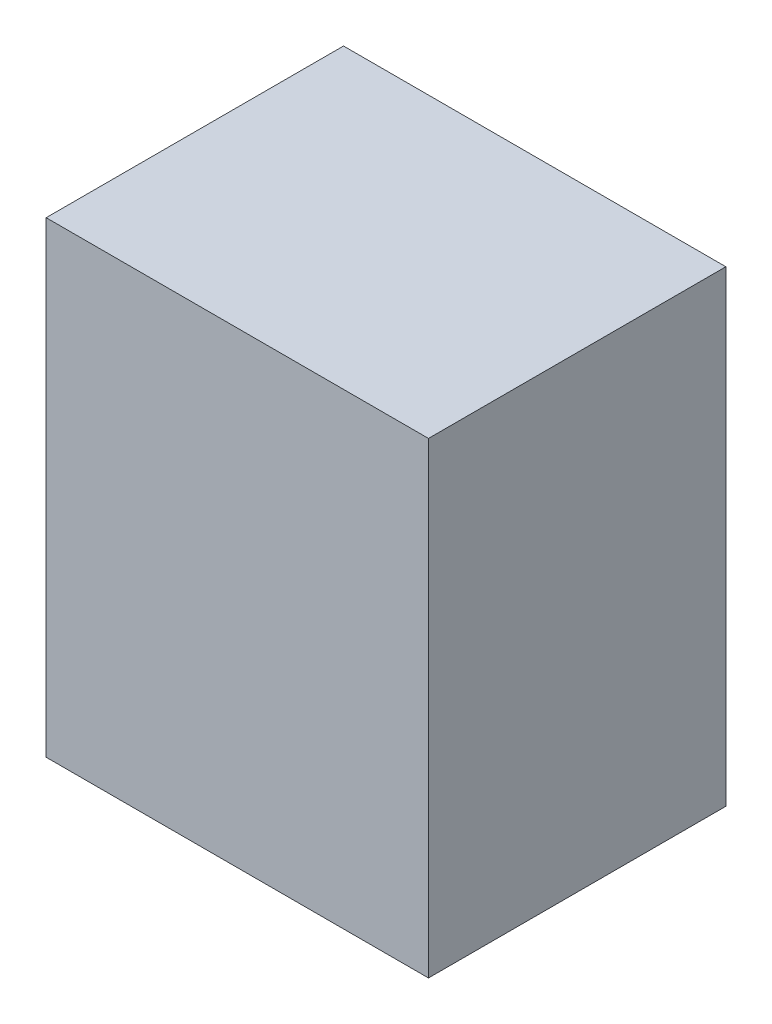
ISO-10303-21;
HEADER;
FILE_DESCRIPTION(('STEP AP214'),'2;1');
FILE_NAME('part.step','',(''),(''),'','','');
FILE_SCHEMA(('AUTOMOTIVE_DESIGN { 1 0 10303 214 1 1 1 1 }'));
ENDSEC;
DATA;
#1=APPLICATION_CONTEXT('core data for automotive mechanical design processes');
#2=APPLICATION_PROTOCOL_DEFINITION('international standard','automotive_design',2000,#1);
#3=PRODUCT_CONTEXT('',#1,'mechanical');
#4=PRODUCT('Part','Part','',(#3));
#5=PRODUCT_RELATED_PRODUCT_CATEGORY('part','',(#4));
#6=PRODUCT_DEFINITION_FORMATION('','',#4);
#7=PRODUCT_DEFINITION_CONTEXT('part definition',#1,'design');
#8=PRODUCT_DEFINITION('design','',#6,#7);
#9=PRODUCT_DEFINITION_SHAPE('','',#8);
#10=(LENGTH_UNIT() NAMED_UNIT(*) SI_UNIT(.MILLI.,.METRE.));
#11=(NAMED_UNIT(*) PLANE_ANGLE_UNIT() SI_UNIT($,.RADIAN.));
#12=(NAMED_UNIT(*) SI_UNIT($,.STERADIAN.) SOLID_ANGLE_UNIT());
#13=UNCERTAINTY_MEASURE_WITH_UNIT(LENGTH_MEASURE(1.E-05),#10,'distance_accuracy_value','');
#14=(GEOMETRIC_REPRESENTATION_CONTEXT(3) GLOBAL_UNCERTAINTY_ASSIGNED_CONTEXT((#13)) GLOBAL_UNIT_ASSIGNED_CONTEXT((#10,
#11,#12)) REPRESENTATION_CONTEXT('',''));
#15=CARTESIAN_POINT('',(0.,0.,0.));
#16=DIRECTION('',(0.,0.,1.));
#17=DIRECTION('',(1.,0.,0.));
#18=AXIS2_PLACEMENT_3D('',#15,#16,#17);
#19=CARTESIAN_POINT('',(0.,0.,3.5));
#20=DIRECTION('',(1.,0.,0.));
#21=DIRECTION('',(0.,0.,-1.));
#22=AXIS2_PLACEMENT_3D('',#19,#20,#21);
#23=PLANE('',#22);
#24=DIRECTION('',(0.,-1.,0.));
#25=VECTOR('',#24,1.);
#26=CARTESIAN_POINT('',(0.,0.,0.));
#27=LINE('',#26,#25);
#28=CARTESIAN_POINT('',(0.,5.5,0.));
#29=VERTEX_POINT('',#28);
#30=CARTESIAN_POINT('',(0.,0.,0.));
#31=VERTEX_POINT('',#30);
#32=EDGE_CURVE('E96',#29,#31,#27,.T.);
#33=ORIENTED_EDGE('',*,*,#32,.T.);
#34=DIRECTION('',(0.,0.,-1.));
#35=VECTOR('',#34,1.);
#36=CARTESIAN_POINT('',(0.,0.,3.5));
#37=LINE('',#36,#35);
#38=CARTESIAN_POINT('',(0.,0.,3.5));
#39=VERTEX_POINT('',#38);
#40=EDGE_CURVE('E11',#39,#31,#37,.T.);
#41=ORIENTED_EDGE('',*,*,#40,.F.);
#42=DIRECTION('',(0.,-1.,0.));
#43=VECTOR('',#42,1.);
#44=CARTESIAN_POINT('',(0.,0.,3.5));
#45=LINE('',#44,#43);
#46=CARTESIAN_POINT('',(0.,5.5,3.5));
#47=VERTEX_POINT('',#46);
#48=EDGE_CURVE('E84',#47,#39,#45,.T.);
#49=ORIENTED_EDGE('',*,*,#48,.F.);
#50=DIRECTION('',(0.,0.,-1.));
#51=VECTOR('',#50,1.);
#52=CARTESIAN_POINT('',(0.,5.5,3.5));
#53=LINE('',#52,#51);
#54=EDGE_CURVE('E92',#47,#29,#53,.T.);
#55=ORIENTED_EDGE('',*,*,#54,.T.);
#56=EDGE_LOOP('',(#33,#41,#49,#55));
#57=FACE_BOUND('',#56,.T.);
#58=ADVANCED_FACE('F33',(#57),#23,.F.);
#59=CARTESIAN_POINT('',(0.,0.,3.5));
#60=DIRECTION('',(0.,1.,0.));
#61=DIRECTION('',(0.,0.,1.));
#62=AXIS2_PLACEMENT_3D('',#59,#60,#61);
#63=PLANE('',#62);
#64=DIRECTION('',(1.,0.,0.));
#65=VECTOR('',#64,1.);
#66=CARTESIAN_POINT('',(0.,0.,0.));
#67=LINE('',#66,#65);
#68=CARTESIAN_POINT('',(4.5,0.,0.));
#69=VERTEX_POINT('',#68);
#70=EDGE_CURVE('E88',#31,#69,#67,.T.);
#71=ORIENTED_EDGE('',*,*,#70,.T.);
#72=DIRECTION('',(0.,0.,-1.));
#73=VECTOR('',#72,1.);
#74=CARTESIAN_POINT('',(4.5,0.,3.5));
#75=LINE('',#74,#73);
#76=CARTESIAN_POINT('',(4.5,0.,3.5));
#77=VERTEX_POINT('',#76);
#78=EDGE_CURVE('E41',#77,#69,#75,.T.);
#79=ORIENTED_EDGE('',*,*,#78,.F.);
#80=DIRECTION('',(1.,0.,0.));
#81=VECTOR('',#80,1.);
#82=CARTESIAN_POINT('',(0.,0.,3.5));
#83=LINE('',#82,#81);
#84=EDGE_CURVE('E79',#39,#77,#83,.T.);
#85=ORIENTED_EDGE('',*,*,#84,.F.);
#86=ORIENTED_EDGE('',*,*,#40,.T.);
#87=EDGE_LOOP('',(#71,#79,#85,#86));
#88=FACE_BOUND('',#87,.T.);
#89=ADVANCED_FACE('F87',(#88),#63,.F.);
#90=CARTESIAN_POINT('',(4.5,0.,3.5));
#91=DIRECTION('',(-1.,0.,0.));
#92=DIRECTION('',(0.,0.,1.));
#93=AXIS2_PLACEMENT_3D('',#90,#91,#92);
#94=PLANE('',#93);
#95=DIRECTION('',(0.,1.,0.));
#96=VECTOR('',#95,1.);
#97=CARTESIAN_POINT('',(4.5,0.,0.));
#98=LINE('',#97,#96);
#99=CARTESIAN_POINT('',(4.5,5.5,0.));
#100=VERTEX_POINT('',#99);
#101=EDGE_CURVE('E66',#69,#100,#98,.T.);
#102=ORIENTED_EDGE('',*,*,#101,.T.);
#103=DIRECTION('',(0.,0.,-1.));
#104=VECTOR('',#103,1.);
#105=CARTESIAN_POINT('',(4.5,5.5,3.5));
#106=LINE('',#105,#104);
#107=CARTESIAN_POINT('',(4.5,5.5,3.5));
#108=VERTEX_POINT('',#107);
#109=EDGE_CURVE('E89',#108,#100,#106,.T.);
#110=ORIENTED_EDGE('',*,*,#109,.F.);
#111=DIRECTION('',(0.,1.,0.));
#112=VECTOR('',#111,1.);
#113=CARTESIAN_POINT('',(4.5,0.,3.5));
#114=LINE('',#113,#112);
#115=EDGE_CURVE('E82',#77,#108,#114,.T.);
#116=ORIENTED_EDGE('',*,*,#115,.F.);
#117=ORIENTED_EDGE('',*,*,#78,.T.);
#118=EDGE_LOOP('',(#102,#110,#116,#117));
#119=FACE_BOUND('',#118,.T.);
#120=ADVANCED_FACE('F90',(#119),#94,.F.);
#121=CARTESIAN_POINT('',(0.,5.5,3.5));
#122=DIRECTION('',(0.,-1.,0.));
#123=DIRECTION('',(0.,0.,-1.));
#124=AXIS2_PLACEMENT_3D('',#121,#122,#123);
#125=PLANE('',#124);
#126=DIRECTION('',(-1.,0.,0.));
#127=VECTOR('',#126,1.);
#128=CARTESIAN_POINT('',(0.,5.5,0.));
#129=LINE('',#128,#127);
#130=EDGE_CURVE('E72',#100,#29,#129,.T.);
#131=ORIENTED_EDGE('',*,*,#130,.T.);
#132=ORIENTED_EDGE('',*,*,#54,.F.);
#133=DIRECTION('',(-1.,0.,0.));
#134=VECTOR('',#133,1.);
#135=CARTESIAN_POINT('',(0.,5.5,3.5));
#136=LINE('',#135,#134);
#137=EDGE_CURVE('E49',#108,#47,#136,.T.);
#138=ORIENTED_EDGE('',*,*,#137,.F.);
#139=ORIENTED_EDGE('',*,*,#109,.T.);
#140=EDGE_LOOP('',(#131,#132,#138,#139));
#141=FACE_BOUND('',#140,.T.);
#142=ADVANCED_FACE('F103',(#141),#125,.F.);
#143=CARTESIAN_POINT('',(0.,0.,3.5));
#144=DIRECTION('',(0.,0.,-1.));
#145=DIRECTION('',(-1.,0.,0.));
#146=AXIS2_PLACEMENT_3D('',#143,#144,#145);
#147=PLANE('',#146);
#148=ORIENTED_EDGE('',*,*,#48,.T.);
#149=ORIENTED_EDGE('',*,*,#84,.T.);
#150=ORIENTED_EDGE('',*,*,#115,.T.);
#151=ORIENTED_EDGE('',*,*,#137,.T.);
#152=EDGE_LOOP('',(#148,#149,#150,#151));
#153=FACE_BOUND('',#152,.T.);
#154=ADVANCED_FACE('F80',(#153),#147,.F.);
#155=CARTESIAN_POINT('',(0.,0.,0.));
#156=DIRECTION('',(0.,0.,-1.));
#157=DIRECTION('',(-1.,0.,0.));
#158=AXIS2_PLACEMENT_3D('',#155,#156,#157);
#159=PLANE('',#158);
#160=ORIENTED_EDGE('',*,*,#32,.F.);
#161=ORIENTED_EDGE('',*,*,#130,.F.);
#162=ORIENTED_EDGE('',*,*,#101,.F.);
#163=ORIENTED_EDGE('',*,*,#70,.F.);
#164=EDGE_LOOP('',(#160,#161,#162,#163));
#165=FACE_BOUND('',#164,.T.);
#166=ADVANCED_FACE('F106',(#165),#159,.T.);
#167=CLOSED_SHELL('',(#58,#89,#120,#142,#154,#166));
#168=MANIFOLD_SOLID_BREP('B2',#167);
#169=ADVANCED_BREP_SHAPE_REPRESENTATION('',(#18,#168),#14);
#170=SHAPE_DEFINITION_REPRESENTATION(#9,#169);
ENDSEC;
END-ISO-10303-21;
